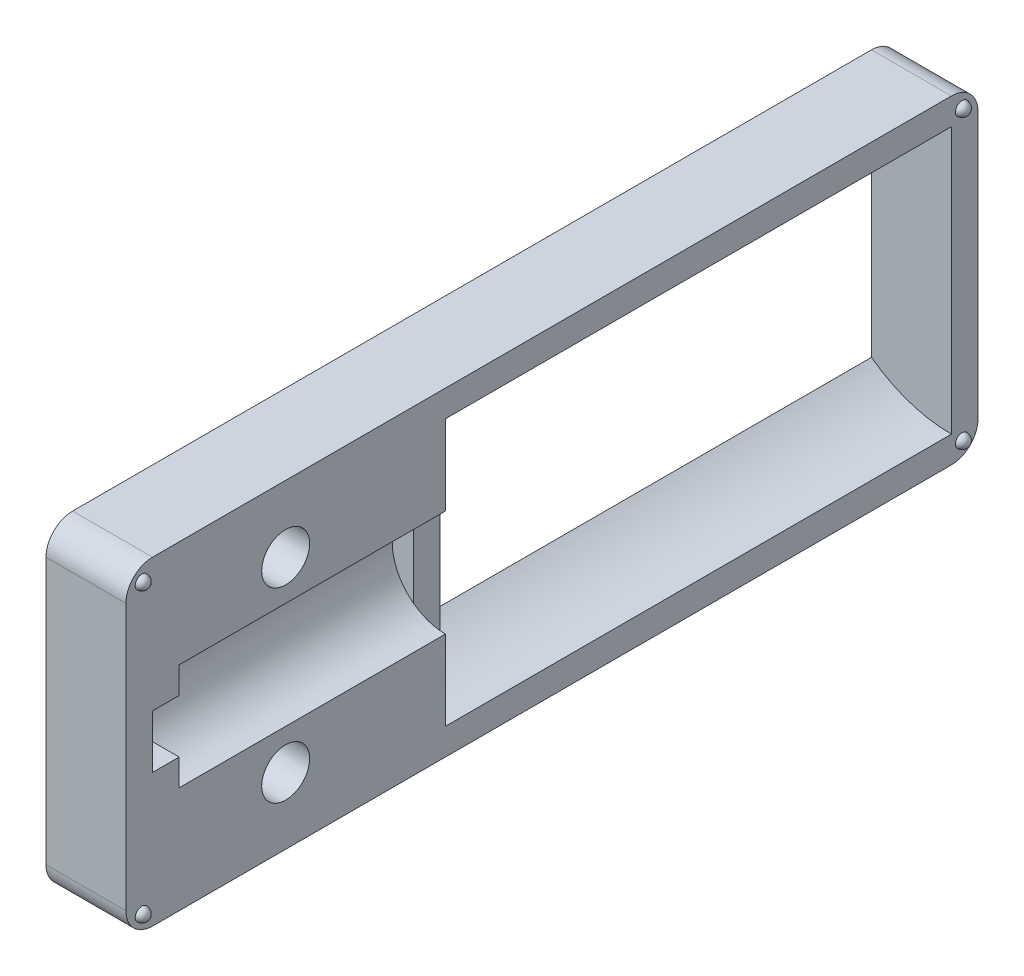
ISO-10303-21;
HEADER;
FILE_DESCRIPTION(('STEP AP214'),'2;1');
FILE_NAME('part.step','',(''),(''),'','','');
FILE_SCHEMA(('AUTOMOTIVE_DESIGN { 1 0 10303 214 1 1 1 1 }'));
ENDSEC;
DATA;
#1=APPLICATION_CONTEXT('core data for automotive mechanical design processes');
#2=APPLICATION_PROTOCOL_DEFINITION('international standard','automotive_design',2000,#1);
#3=PRODUCT_CONTEXT('',#1,'mechanical');
#4=PRODUCT('Part','Part','',(#3));
#5=PRODUCT_RELATED_PRODUCT_CATEGORY('part','',(#4));
#6=PRODUCT_DEFINITION_FORMATION('','',#4);
#7=PRODUCT_DEFINITION_CONTEXT('part definition',#1,'design');
#8=PRODUCT_DEFINITION('design','',#6,#7);
#9=PRODUCT_DEFINITION_SHAPE('','',#8);
#10=(LENGTH_UNIT() NAMED_UNIT(*) SI_UNIT(.MILLI.,.METRE.));
#11=(NAMED_UNIT(*) PLANE_ANGLE_UNIT() SI_UNIT($,.RADIAN.));
#12=(NAMED_UNIT(*) SI_UNIT($,.STERADIAN.) SOLID_ANGLE_UNIT());
#13=UNCERTAINTY_MEASURE_WITH_UNIT(LENGTH_MEASURE(1.E-05),#10,'distance_accuracy_value','');
#14=(GEOMETRIC_REPRESENTATION_CONTEXT(3) GLOBAL_UNCERTAINTY_ASSIGNED_CONTEXT((#13)) GLOBAL_UNIT_ASSIGNED_CONTEXT((#10,
#11,#12)) REPRESENTATION_CONTEXT('',''));
#15=CARTESIAN_POINT('',(0.,0.,0.));
#16=DIRECTION('',(0.,0.,1.));
#17=DIRECTION('',(1.,0.,0.));
#18=AXIS2_PLACEMENT_3D('',#15,#16,#17);
#19=CARTESIAN_POINT('',(3.,6.,10.));
#20=DIRECTION('',(0.,0.,-1.));
#21=DIRECTION('',(-1.,0.,0.));
#22=AXIS2_PLACEMENT_3D('',#19,#20,#21);
#23=PLANE('',#22);
#24=DIRECTION('',(1.,0.,0.));
#25=VECTOR('',#24,1.);
#26=CARTESIAN_POINT('',(3.,7.,10.));
#27=LINE('',#26,#25);
#28=CARTESIAN_POINT('',(1.26794919243112,7.,10.));
#29=VERTEX_POINT('',#28);
#30=CARTESIAN_POINT('',(3.,7.,10.));
#31=VERTEX_POINT('',#30);
#32=EDGE_CURVE('E199',#29,#31,#27,.T.);
#33=ORIENTED_EDGE('',*,*,#32,.F.);
#34=CARTESIAN_POINT('',(3.,6.,10.));
#35=DIRECTION('',(0.,0.,-1.));
#36=DIRECTION('',(-1.,0.,0.));
#37=AXIS2_PLACEMENT_3D('',#34,#35,#36);
#38=CIRCLE('',#37,2.);
#39=CARTESIAN_POINT('',(3.,8.,10.));
#40=VERTEX_POINT('',#39);
#41=EDGE_CURVE('E216',#29,#40,#38,.T.);
#42=ORIENTED_EDGE('',*,*,#41,.T.);
#43=DIRECTION('',(0.,1.,0.));
#44=VECTOR('',#43,1.);
#45=CARTESIAN_POINT('',(3.,0.,10.));
#46=LINE('',#45,#44);
#47=EDGE_CURVE('E300',#31,#40,#46,.T.);
#48=ORIENTED_EDGE('',*,*,#47,.F.);
#49=EDGE_LOOP('',(#33,#42,#48));
#50=FACE_BOUND('',#49,.T.);
#51=ADVANCED_FACE('F34',(#50),#23,.T.);
#52=CARTESIAN_POINT('',(0.,0.,0.));
#53=DIRECTION('',(0.,0.,-1.));
#54=DIRECTION('',(-1.,0.,0.));
#55=AXIS2_PLACEMENT_3D('',#52,#53,#54);
#56=PLANE('',#55);
#57=CARTESIAN_POINT('',(3.,6.,0.));
#58=DIRECTION('',(0.,0.,-1.));
#59=DIRECTION('',(-1.,0.,0.));
#60=AXIS2_PLACEMENT_3D('',#57,#58,#59);
#61=CIRCLE('',#60,2.);
#62=CARTESIAN_POINT('',(1.8,7.6,0.));
#63=VERTEX_POINT('',#62);
#64=CARTESIAN_POINT('',(3.,8.,0.));
#65=VERTEX_POINT('',#64);
#66=EDGE_CURVE('E217',#63,#65,#61,.T.);
#67=ORIENTED_EDGE('',*,*,#66,.F.);
#68=DIRECTION('',(0.,-1.,0.));
#69=VECTOR('',#68,1.);
#70=CARTESIAN_POINT('',(1.8,0.,0.));
#71=LINE('',#70,#69);
#72=CARTESIAN_POINT('',(1.8,10.8538644398046,0.));
#73=VERTEX_POINT('',#72);
#74=EDGE_CURVE('E293',#73,#63,#71,.T.);
#75=ORIENTED_EDGE('',*,*,#74,.F.);
#76=CARTESIAN_POINT('',(3.,6.,0.));
#77=DIRECTION('',(0.,0.,1.));
#78=DIRECTION('',(1.,0.,0.));
#79=AXIS2_PLACEMENT_3D('',#76,#77,#78);
#80=CIRCLE('',#79,5.);
#81=CARTESIAN_POINT('',(3.,11.,0.));
#82=VERTEX_POINT('',#81);
#83=EDGE_CURVE('E247',#82,#73,#80,.T.);
#84=ORIENTED_EDGE('',*,*,#83,.F.);
#85=DIRECTION('',(0.,1.,0.));
#86=VECTOR('',#85,1.);
#87=CARTESIAN_POINT('',(3.,12.,0.));
#88=LINE('',#87,#86);
#89=EDGE_CURVE('E239',#65,#82,#88,.T.);
#90=ORIENTED_EDGE('',*,*,#89,.F.);
#91=EDGE_LOOP('',(#67,#75,#84,#90));
#92=FACE_BOUND('',#91,.T.);
#93=ADVANCED_FACE('F400',(#92),#56,.T.);
#94=CARTESIAN_POINT('',(0.,0.,-20.));
#95=DIRECTION('',(1.,0.,0.));
#96=DIRECTION('',(0.,0.,-1.));
#97=AXIS2_PLACEMENT_3D('',#94,#95,#96);
#98=PLANE('',#97);
#99=CARTESIAN_POINT('',(0.,2.5,6.));
#100=DIRECTION('',(1.,0.,0.));
#101=DIRECTION('',(0.,0.,1.));
#102=AXIS2_PLACEMENT_3D('',#99,#100,#101);
#103=CIRCLE('',#102,1.6);
#104=CARTESIAN_POINT('',(0.,2.5,7.6));
#105=VERTEX_POINT('',#104);
#106=EDGE_CURVE('E374',#105,#105,#103,.T.);
#107=ORIENTED_EDGE('',*,*,#106,.T.);
#108=EDGE_LOOP('',(#107));
#109=FACE_BOUND('',#108,.T.);
#110=CARTESIAN_POINT('',(0.,9.5,6.));
#111=DIRECTION('',(-1.,0.,0.));
#112=DIRECTION('',(0.,0.,1.));
#113=AXIS2_PLACEMENT_3D('',#110,#111,#112);
#114=CIRCLE('',#113,1.6);
#115=CARTESIAN_POINT('',(0.,9.5,7.6));
#116=VERTEX_POINT('',#115);
#117=EDGE_CURVE('E364',#116,#116,#114,.T.);
#118=ORIENTED_EDGE('',*,*,#117,.F.);
#119=EDGE_LOOP('',(#118));
#120=FACE_BOUND('',#119,.T.);
#121=DIRECTION('',(0.,0.,1.));
#122=VECTOR('',#121,1.);
#123=CARTESIAN_POINT('',(0.,10.,-19.));
#124=LINE('',#123,#122);
#125=CARTESIAN_POINT('',(0.,10.,-19.));
#126=VERTEX_POINT('',#125);
#127=CARTESIAN_POINT('',(0.,10.,-1.));
#128=VERTEX_POINT('',#127);
#129=EDGE_CURVE('E263',#126,#128,#124,.T.);
#130=ORIENTED_EDGE('',*,*,#129,.T.);
#131=DIRECTION('',(0.,-1.,0.));
#132=VECTOR('',#131,1.);
#133=CARTESIAN_POINT('',(0.,12.,-1.));
#134=LINE('',#133,#132);
#135=CARTESIAN_POINT('',(0.,2.,-1.));
#136=VERTEX_POINT('',#135);
#137=EDGE_CURVE('E225',#128,#136,#134,.T.);
#138=ORIENTED_EDGE('',*,*,#137,.T.);
#139=DIRECTION('',(0.,0.,1.));
#140=VECTOR('',#139,1.);
#141=CARTESIAN_POINT('',(0.,2.,-19.));
#142=LINE('',#141,#140);
#143=CARTESIAN_POINT('',(0.,2.,-19.));
#144=VERTEX_POINT('',#143);
#145=EDGE_CURVE('E261',#136,#144,#142,.F.);
#146=ORIENTED_EDGE('',*,*,#145,.T.);
#147=DIRECTION('',(0.,-1.,0.));
#148=VECTOR('',#147,1.);
#149=CARTESIAN_POINT('',(0.,0.,-19.));
#150=LINE('',#149,#148);
#151=EDGE_CURVE('E266',#126,#144,#150,.T.);
#152=ORIENTED_EDGE('',*,*,#151,.F.);
#153=EDGE_LOOP('',(#130,#138,#146,#152));
#154=FACE_BOUND('',#153,.T.);
#155=DIRECTION('',(0.,0.,1.));
#156=VECTOR('',#155,1.);
#157=CARTESIAN_POINT('',(0.,0.,-20.));
#158=LINE('',#157,#156);
#159=CARTESIAN_POINT('',(0.,0.,-19.));
#160=VERTEX_POINT('',#159);
#161=CARTESIAN_POINT('',(0.,0.,11.));
#162=VERTEX_POINT('',#161);
#163=EDGE_CURVE('E274',#160,#162,#158,.T.);
#164=ORIENTED_EDGE('',*,*,#163,.T.);
#165=CARTESIAN_POINT('',(0.,1.,11.));
#166=DIRECTION('',(1.,0.,0.));
#167=DIRECTION('',(0.,0.,-1.));
#168=AXIS2_PLACEMENT_3D('',#165,#166,#167);
#169=CIRCLE('',#168,1.);
#170=CARTESIAN_POINT('',(0.,1.,12.));
#171=VERTEX_POINT('',#170);
#172=EDGE_CURVE('E326',#162,#171,#169,.F.);
#173=ORIENTED_EDGE('',*,*,#172,.T.);
#174=DIRECTION('',(0.,-1.,0.));
#175=VECTOR('',#174,1.);
#176=CARTESIAN_POINT('',(0.,12.,12.));
#177=LINE('',#176,#175);
#178=CARTESIAN_POINT('',(0.,11.,12.));
#179=VERTEX_POINT('',#178);
#180=EDGE_CURVE('E243',#179,#171,#177,.T.);
#181=ORIENTED_EDGE('',*,*,#180,.F.);
#182=CARTESIAN_POINT('',(0.,11.,11.));
#183=DIRECTION('',(1.,0.,0.));
#184=DIRECTION('',(0.,0.,-1.));
#185=AXIS2_PLACEMENT_3D('',#182,#183,#184);
#186=CIRCLE('',#185,1.);
#187=CARTESIAN_POINT('',(0.,12.,11.));
#188=VERTEX_POINT('',#187);
#189=EDGE_CURVE('E324',#179,#188,#186,.F.);
#190=ORIENTED_EDGE('',*,*,#189,.T.);
#191=DIRECTION('',(0.,0.,1.));
#192=VECTOR('',#191,1.);
#193=CARTESIAN_POINT('',(0.,12.,-20.));
#194=LINE('',#193,#192);
#195=CARTESIAN_POINT('',(0.,12.,-19.));
#196=VERTEX_POINT('',#195);
#197=EDGE_CURVE('E283',#196,#188,#194,.T.);
#198=ORIENTED_EDGE('',*,*,#197,.F.);
#199=CARTESIAN_POINT('',(0.,11.,-19.));
#200=DIRECTION('',(1.,0.,0.));
#201=DIRECTION('',(0.,0.,-1.));
#202=AXIS2_PLACEMENT_3D('',#199,#200,#201);
#203=CIRCLE('',#202,1.);
#204=CARTESIAN_POINT('',(0.,11.,-20.));
#205=VERTEX_POINT('',#204);
#206=EDGE_CURVE('E49',#196,#205,#203,.F.);
#207=ORIENTED_EDGE('',*,*,#206,.T.);
#208=DIRECTION('',(0.,1.,0.));
#209=VECTOR('',#208,1.);
#210=CARTESIAN_POINT('',(0.,0.,-20.));
#211=LINE('',#210,#209);
#212=CARTESIAN_POINT('',(0.,1.,-20.));
#213=VERTEX_POINT('',#212);
#214=EDGE_CURVE('E269',#213,#205,#211,.T.);
#215=ORIENTED_EDGE('',*,*,#214,.F.);
#216=CARTESIAN_POINT('',(0.,1.,-19.));
#217=DIRECTION('',(1.,0.,0.));
#218=DIRECTION('',(0.,0.,-1.));
#219=AXIS2_PLACEMENT_3D('',#216,#217,#218);
#220=CIRCLE('',#219,1.);
#221=EDGE_CURVE('E322',#213,#160,#220,.F.);
#222=ORIENTED_EDGE('',*,*,#221,.T.);
#223=EDGE_LOOP('',(#164,#173,#181,#190,#198,#207,#215,#222));
#224=FACE_BOUND('',#223,.T.);
#225=ADVANCED_FACE('F440',(#109,#120,#154,#224),#98,.F.);
#226=CARTESIAN_POINT('',(0.,12.,-20.));
#227=DIRECTION('',(0.,-1.,0.));
#228=DIRECTION('',(0.,0.,-1.));
#229=AXIS2_PLACEMENT_3D('',#226,#227,#228);
#230=PLANE('',#229);
#231=ORIENTED_EDGE('',*,*,#197,.T.);
#232=DIRECTION('',(-1.,0.,0.));
#233=VECTOR('',#232,1.);
#234=CARTESIAN_POINT('',(0.,12.,11.));
#235=LINE('',#234,#233);
#236=CARTESIAN_POINT('',(3.,12.,11.));
#237=VERTEX_POINT('',#236);
#238=EDGE_CURVE('E330',#188,#237,#235,.F.);
#239=ORIENTED_EDGE('',*,*,#238,.T.);
#240=DIRECTION('',(0.,0.,1.));
#241=VECTOR('',#240,1.);
#242=CARTESIAN_POINT('',(3.,12.,-20.));
#243=LINE('',#242,#241);
#244=CARTESIAN_POINT('',(3.,12.,-19.));
#245=VERTEX_POINT('',#244);
#246=EDGE_CURVE('E280',#245,#237,#243,.T.);
#247=ORIENTED_EDGE('',*,*,#246,.F.);
#248=DIRECTION('',(1.,0.,0.));
#249=VECTOR('',#248,1.);
#250=CARTESIAN_POINT('',(0.,12.,-19.));
#251=LINE('',#250,#249);
#252=EDGE_CURVE('E328',#245,#196,#251,.F.);
#253=ORIENTED_EDGE('',*,*,#252,.T.);
#254=EDGE_LOOP('',(#231,#239,#247,#253));
#255=FACE_BOUND('',#254,.T.);
#256=ADVANCED_FACE('F349',(#255),#230,.F.);
#257=CARTESIAN_POINT('',(3.,0.,-20.));
#258=DIRECTION('',(1.,0.,0.));
#259=DIRECTION('',(0.,0.,-1.));
#260=AXIS2_PLACEMENT_3D('',#257,#258,#259);
#261=PLANE('',#260);
#262=CARTESIAN_POINT('',(3.,0.6,11.4));
#263=DIRECTION('',(1.,0.,0.));
#264=DIRECTION('',(0.,0.,-1.));
#265=AXIS2_PLACEMENT_3D('',#262,#263,#264);
#266=CIRCLE('',#265,0.25);
#267=CARTESIAN_POINT('',(3.,0.6,11.15));
#268=VERTEX_POINT('',#267);
#269=EDGE_CURVE('E12',#268,#268,#266,.T.);
#270=ORIENTED_EDGE('',*,*,#269,.F.);
#271=EDGE_LOOP('',(#270));
#272=FACE_BOUND('',#271,.T.);
#273=CARTESIAN_POINT('',(3.,0.6,-19.4));
#274=DIRECTION('',(1.,0.,0.));
#275=DIRECTION('',(0.,0.,-1.));
#276=AXIS2_PLACEMENT_3D('',#273,#274,#275);
#277=CIRCLE('',#276,0.25);
#278=CARTESIAN_POINT('',(3.,0.6,-19.65));
#279=VERTEX_POINT('',#278);
#280=EDGE_CURVE('E42',#279,#279,#277,.T.);
#281=ORIENTED_EDGE('',*,*,#280,.F.);
#282=EDGE_LOOP('',(#281));
#283=FACE_BOUND('',#282,.T.);
#284=CARTESIAN_POINT('',(3.,11.4,11.4));
#285=DIRECTION('',(1.,0.,0.));
#286=DIRECTION('',(0.,0.,-1.));
#287=AXIS2_PLACEMENT_3D('',#284,#285,#286);
#288=CIRCLE('',#287,0.25);
#289=CARTESIAN_POINT('',(3.,11.4,11.15));
#290=VERTEX_POINT('',#289);
#291=EDGE_CURVE('E339',#290,#290,#288,.T.);
#292=ORIENTED_EDGE('',*,*,#291,.F.);
#293=EDGE_LOOP('',(#292));
#294=FACE_BOUND('',#293,.T.);
#295=CARTESIAN_POINT('',(3.,11.4,-19.4));
#296=DIRECTION('',(1.,0.,0.));
#297=DIRECTION('',(0.,0.,-1.));
#298=AXIS2_PLACEMENT_3D('',#295,#296,#297);
#299=CIRCLE('',#298,0.25);
#300=CARTESIAN_POINT('',(3.,11.4,-19.65));
#301=VERTEX_POINT('',#300);
#302=EDGE_CURVE('E336',#301,#301,#299,.T.);
#303=ORIENTED_EDGE('',*,*,#302,.F.);
#304=EDGE_LOOP('',(#303));
#305=FACE_BOUND('',#304,.T.);
#306=CARTESIAN_POINT('',(3.,2.5,6.));
#307=DIRECTION('',(1.,0.,0.));
#308=DIRECTION('',(0.,0.,1.));
#309=AXIS2_PLACEMENT_3D('',#306,#307,#308);
#310=CIRCLE('',#309,0.899999999999999);
#311=CARTESIAN_POINT('',(3.,2.5,6.9));
#312=VERTEX_POINT('',#311);
#313=EDGE_CURVE('E359',#312,#312,#310,.T.);
#314=ORIENTED_EDGE('',*,*,#313,.F.);
#315=EDGE_LOOP('',(#314));
#316=FACE_BOUND('',#315,.T.);
#317=CARTESIAN_POINT('',(3.,9.5,6.));
#318=DIRECTION('',(-1.,0.,0.));
#319=DIRECTION('',(0.,0.,1.));
#320=AXIS2_PLACEMENT_3D('',#317,#318,#319);
#321=CIRCLE('',#320,0.899999999999999);
#322=CARTESIAN_POINT('',(3.,9.5,6.9));
#323=VERTEX_POINT('',#322);
#324=EDGE_CURVE('E362',#323,#323,#321,.T.);
#325=ORIENTED_EDGE('',*,*,#324,.T.);
#326=EDGE_LOOP('',(#325));
#327=FACE_BOUND('',#326,.T.);
#328=DIRECTION('',(0.,0.,-1.));
#329=VECTOR('',#328,1.);
#330=CARTESIAN_POINT('',(3.,7.,11.));
#331=LINE('',#330,#329);
#332=CARTESIAN_POINT('',(3.,7.,11.));
#333=VERTEX_POINT('',#332);
#334=EDGE_CURVE('E383',#333,#31,#331,.T.);
#335=ORIENTED_EDGE('',*,*,#334,.T.);
#336=ORIENTED_EDGE('',*,*,#47,.T.);
#337=DIRECTION('',(0.,0.,-1.));
#338=VECTOR('',#337,1.);
#339=CARTESIAN_POINT('',(3.,8.,10.));
#340=LINE('',#339,#338);
#341=EDGE_CURVE('E215',#65,#40,#340,.F.);
#342=ORIENTED_EDGE('',*,*,#341,.F.);
#343=ORIENTED_EDGE('',*,*,#89,.T.);
#344=DIRECTION('',(0.,0.,1.));
#345=VECTOR('',#344,1.);
#346=CARTESIAN_POINT('',(3.,11.,-19.));
#347=LINE('',#346,#345);
#348=CARTESIAN_POINT('',(3.,11.,-19.));
#349=VERTEX_POINT('',#348);
#350=EDGE_CURVE('E258',#349,#82,#347,.T.);
#351=ORIENTED_EDGE('',*,*,#350,.F.);
#352=DIRECTION('',(0.,-1.,0.));
#353=VECTOR('',#352,1.);
#354=CARTESIAN_POINT('',(3.,0.,-19.));
#355=LINE('',#354,#353);
#356=CARTESIAN_POINT('',(3.,0.999999999999997,-19.));
#357=VERTEX_POINT('',#356);
#358=EDGE_CURVE('E289',#349,#357,#355,.T.);
#359=ORIENTED_EDGE('',*,*,#358,.T.);
#360=DIRECTION('',(0.,0.,1.));
#361=VECTOR('',#360,1.);
#362=CARTESIAN_POINT('',(3.,0.999999999999997,-19.));
#363=LINE('',#362,#361);
#364=CARTESIAN_POINT('',(3.,0.999999999999997,0.));
#365=VERTEX_POINT('',#364);
#366=EDGE_CURVE('E253',#365,#357,#363,.F.);
#367=ORIENTED_EDGE('',*,*,#366,.F.);
#368=CARTESIAN_POINT('',(3.,4.,0.));
#369=VERTEX_POINT('',#368);
#370=EDGE_CURVE('E244',#365,#369,#88,.T.);
#371=ORIENTED_EDGE('',*,*,#370,.T.);
#372=DIRECTION('',(0.,0.,-1.));
#373=VECTOR('',#372,1.);
#374=CARTESIAN_POINT('',(3.,4.,10.));
#375=LINE('',#374,#373);
#376=CARTESIAN_POINT('',(3.,4.,10.));
#377=VERTEX_POINT('',#376);
#378=EDGE_CURVE('E223',#377,#369,#375,.T.);
#379=ORIENTED_EDGE('',*,*,#378,.F.);
#380=CARTESIAN_POINT('',(3.,5.,10.));
#381=VERTEX_POINT('',#380);
#382=EDGE_CURVE('E205',#377,#381,#46,.T.);
#383=ORIENTED_EDGE('',*,*,#382,.T.);
#384=DIRECTION('',(0.,0.,-1.));
#385=VECTOR('',#384,1.);
#386=CARTESIAN_POINT('',(3.,5.,11.));
#387=LINE('',#386,#385);
#388=CARTESIAN_POINT('',(3.,5.,11.));
#389=VERTEX_POINT('',#388);
#390=EDGE_CURVE('E183',#389,#381,#387,.T.);
#391=ORIENTED_EDGE('',*,*,#390,.F.);
#392=DIRECTION('',(0.,-1.,0.));
#393=VECTOR('',#392,1.);
#394=CARTESIAN_POINT('',(3.,7.,11.));
#395=LINE('',#394,#393);
#396=EDGE_CURVE('E190',#333,#389,#395,.T.);
#397=ORIENTED_EDGE('',*,*,#396,.F.);
#398=EDGE_LOOP('',(#335,#336,#342,#343,#351,#359,#367,#371,#379,#383,#391,#397));
#399=FACE_BOUND('',#398,.T.);
#400=DIRECTION('',(0.,1.,0.));
#401=VECTOR('',#400,1.);
#402=CARTESIAN_POINT('',(3.,12.,12.));
#403=LINE('',#402,#401);
#404=CARTESIAN_POINT('',(3.,1.,12.));
#405=VERTEX_POINT('',#404);
#406=CARTESIAN_POINT('',(3.,11.,12.));
#407=VERTEX_POINT('',#406);
#408=EDGE_CURVE('E240',#405,#407,#403,.T.);
#409=ORIENTED_EDGE('',*,*,#408,.F.);
#410=CARTESIAN_POINT('',(3.,1.,11.));
#411=DIRECTION('',(1.,0.,0.));
#412=DIRECTION('',(0.,0.,-1.));
#413=AXIS2_PLACEMENT_3D('',#410,#411,#412);
#414=CIRCLE('',#413,1.);
#415=CARTESIAN_POINT('',(3.,0.,11.));
#416=VERTEX_POINT('',#415);
#417=EDGE_CURVE('E314',#405,#416,#414,.T.);
#418=ORIENTED_EDGE('',*,*,#417,.T.);
#419=DIRECTION('',(0.,0.,1.));
#420=VECTOR('',#419,1.);
#421=CARTESIAN_POINT('',(3.,0.,-20.));
#422=LINE('',#421,#420);
#423=CARTESIAN_POINT('',(3.,0.,-19.));
#424=VERTEX_POINT('',#423);
#425=EDGE_CURVE('E277',#424,#416,#422,.T.);
#426=ORIENTED_EDGE('',*,*,#425,.F.);
#427=CARTESIAN_POINT('',(3.,1.,-19.));
#428=DIRECTION('',(1.,0.,0.));
#429=DIRECTION('',(0.,0.,-1.));
#430=AXIS2_PLACEMENT_3D('',#427,#428,#429);
#431=CIRCLE('',#430,1.);
#432=CARTESIAN_POINT('',(3.,1.,-20.));
#433=VERTEX_POINT('',#432);
#434=EDGE_CURVE('E310',#424,#433,#431,.T.);
#435=ORIENTED_EDGE('',*,*,#434,.T.);
#436=DIRECTION('',(0.,1.,0.));
#437=VECTOR('',#436,1.);
#438=CARTESIAN_POINT('',(3.,0.,-20.));
#439=LINE('',#438,#437);
#440=CARTESIAN_POINT('',(3.,11.,-20.));
#441=VERTEX_POINT('',#440);
#442=EDGE_CURVE('E271',#433,#441,#439,.T.);
#443=ORIENTED_EDGE('',*,*,#442,.T.);
#444=CARTESIAN_POINT('',(3.,11.,-19.));
#445=DIRECTION('',(1.,0.,0.));
#446=DIRECTION('',(0.,0.,-1.));
#447=AXIS2_PLACEMENT_3D('',#444,#445,#446);
#448=CIRCLE('',#447,1.);
#449=EDGE_CURVE('E308',#441,#245,#448,.T.);
#450=ORIENTED_EDGE('',*,*,#449,.T.);
#451=ORIENTED_EDGE('',*,*,#246,.T.);
#452=CARTESIAN_POINT('',(3.,11.,11.));
#453=DIRECTION('',(1.,0.,0.));
#454=DIRECTION('',(0.,0.,-1.));
#455=AXIS2_PLACEMENT_3D('',#452,#453,#454);
#456=CIRCLE('',#455,1.);
#457=EDGE_CURVE('E312',#237,#407,#456,.T.);
#458=ORIENTED_EDGE('',*,*,#457,.T.);
#459=EDGE_LOOP('',(#409,#418,#426,#435,#443,#450,#451,#458));
#460=FACE_BOUND('',#459,.T.);
#461=ADVANCED_FACE('F202',(#272,#283,#294,#305,#316,#327,#399,#460),#261,.T.);
#462=CARTESIAN_POINT('',(0.,0.,-20.));
#463=DIRECTION('',(0.,-1.,0.));
#464=DIRECTION('',(0.,0.,-1.));
#465=AXIS2_PLACEMENT_3D('',#462,#463,#464);
#466=PLANE('',#465);
#467=ORIENTED_EDGE('',*,*,#425,.T.);
#468=DIRECTION('',(1.,0.,0.));
#469=VECTOR('',#468,1.);
#470=CARTESIAN_POINT('',(0.,0.,11.));
#471=LINE('',#470,#469);
#472=EDGE_CURVE('E319',#416,#162,#471,.F.);
#473=ORIENTED_EDGE('',*,*,#472,.T.);
#474=ORIENTED_EDGE('',*,*,#163,.F.);
#475=DIRECTION('',(1.,0.,0.));
#476=VECTOR('',#475,1.);
#477=CARTESIAN_POINT('',(0.,0.,-19.));
#478=LINE('',#477,#476);
#479=EDGE_CURVE('E316',#160,#424,#478,.T.);
#480=ORIENTED_EDGE('',*,*,#479,.T.);
#481=EDGE_LOOP('',(#467,#473,#474,#480));
#482=FACE_BOUND('',#481,.T.);
#483=ADVANCED_FACE('F348',(#482),#466,.T.);
#484=CARTESIAN_POINT('',(0.,0.,-20.));
#485=DIRECTION('',(0.,0.,-1.));
#486=DIRECTION('',(-1.,0.,0.));
#487=AXIS2_PLACEMENT_3D('',#484,#485,#486);
#488=PLANE('',#487);
#489=ORIENTED_EDGE('',*,*,#442,.F.);
#490=DIRECTION('',(1.,0.,0.));
#491=VECTOR('',#490,1.);
#492=CARTESIAN_POINT('',(0.,1.,-20.));
#493=LINE('',#492,#491);
#494=EDGE_CURVE('E56',#433,#213,#493,.F.);
#495=ORIENTED_EDGE('',*,*,#494,.T.);
#496=ORIENTED_EDGE('',*,*,#214,.T.);
#497=DIRECTION('',(1.,0.,0.));
#498=VECTOR('',#497,1.);
#499=CARTESIAN_POINT('',(3.,11.,-20.));
#500=LINE('',#499,#498);
#501=EDGE_CURVE('E332',#205,#441,#500,.T.);
#502=ORIENTED_EDGE('',*,*,#501,.T.);
#503=EDGE_LOOP('',(#489,#495,#496,#502));
#504=FACE_BOUND('',#503,.T.);
#505=ADVANCED_FACE('F462',(#504),#488,.T.);
#506=CARTESIAN_POINT('',(3.,6.,-19.));
#507=DIRECTION('',(0.,0.,1.));
#508=DIRECTION('',(1.,0.,0.));
#509=AXIS2_PLACEMENT_3D('',#506,#507,#508);
#510=PLANE('',#509);
#511=ORIENTED_EDGE('',*,*,#151,.T.);
#512=CARTESIAN_POINT('',(3.,6.,-19.));
#513=DIRECTION('',(0.,0.,1.));
#514=DIRECTION('',(1.,0.,0.));
#515=AXIS2_PLACEMENT_3D('',#512,#513,#514);
#516=CIRCLE('',#515,5.);
#517=EDGE_CURVE('E254',#144,#357,#516,.T.);
#518=ORIENTED_EDGE('',*,*,#517,.T.);
#519=ORIENTED_EDGE('',*,*,#358,.F.);
#520=EDGE_CURVE('E250',#349,#126,#516,.T.);
#521=ORIENTED_EDGE('',*,*,#520,.T.);
#522=EDGE_LOOP('',(#511,#518,#519,#521));
#523=FACE_BOUND('',#522,.T.);
#524=ADVANCED_FACE('F409',(#523),#510,.T.);
#525=CARTESIAN_POINT('',(3.,6.,-19.));
#526=DIRECTION('',(0.,0.,1.));
#527=DIRECTION('',(1.,0.,0.));
#528=AXIS2_PLACEMENT_3D('',#525,#526,#527);
#529=CYLINDRICAL_SURFACE('',#528,5.);
#530=ORIENTED_EDGE('',*,*,#83,.T.);
#531=DIRECTION('',(0.,0.,1.));
#532=VECTOR('',#531,1.);
#533=CARTESIAN_POINT('',(1.8,10.8538644398046,-19.));
#534=LINE('',#533,#532);
#535=CARTESIAN_POINT('',(1.8,10.8538644398046,-1.));
#536=VERTEX_POINT('',#535);
#537=EDGE_CURVE('E234',#73,#536,#534,.F.);
#538=ORIENTED_EDGE('',*,*,#537,.T.);
#539=CARTESIAN_POINT('',(3.,6.,-1.));
#540=DIRECTION('',(0.,0.,1.));
#541=DIRECTION('',(1.,0.,0.));
#542=AXIS2_PLACEMENT_3D('',#539,#540,#541);
#543=CIRCLE('',#542,5.);
#544=EDGE_CURVE('E236',#128,#536,#543,.F.);
#545=ORIENTED_EDGE('',*,*,#544,.F.);
#546=ORIENTED_EDGE('',*,*,#129,.F.);
#547=ORIENTED_EDGE('',*,*,#520,.F.);
#548=ORIENTED_EDGE('',*,*,#350,.T.);
#549=EDGE_LOOP('',(#530,#538,#545,#546,#547,#548));
#550=FACE_BOUND('',#549,.T.);
#551=ADVANCED_FACE('F404',(#550),#529,.F.);
#552=CARTESIAN_POINT('',(3.,6.,-1.));
#553=DIRECTION('',(0.,0.,1.));
#554=DIRECTION('',(1.,0.,0.));
#555=AXIS2_PLACEMENT_3D('',#552,#553,#554);
#556=CIRCLE('',#555,5.);
#557=CARTESIAN_POINT('',(1.8,1.14613556019536,-1.));
#558=VERTEX_POINT('',#557);
#559=EDGE_CURVE('E296',#558,#136,#556,.F.);
#560=ORIENTED_EDGE('',*,*,#559,.F.);
#561=DIRECTION('',(0.,0.,1.));
#562=VECTOR('',#561,1.);
#563=CARTESIAN_POINT('',(1.8,1.14613556019536,-19.));
#564=LINE('',#563,#562);
#565=CARTESIAN_POINT('',(1.8,1.14613556019536,0.));
#566=VERTEX_POINT('',#565);
#567=EDGE_CURVE('E231',#558,#566,#564,.T.);
#568=ORIENTED_EDGE('',*,*,#567,.T.);
#569=CARTESIAN_POINT('',(3.,6.,0.));
#570=DIRECTION('',(0.,0.,-1.));
#571=DIRECTION('',(-1.,0.,0.));
#572=AXIS2_PLACEMENT_3D('',#569,#570,#571);
#573=CIRCLE('',#572,5.);
#574=EDGE_CURVE('E286',#365,#566,#573,.T.);
#575=ORIENTED_EDGE('',*,*,#574,.F.);
#576=ORIENTED_EDGE('',*,*,#366,.T.);
#577=ORIENTED_EDGE('',*,*,#517,.F.);
#578=ORIENTED_EDGE('',*,*,#145,.F.);
#579=EDGE_LOOP('',(#560,#568,#575,#576,#577,#578));
#580=FACE_BOUND('',#579,.T.);
#581=ADVANCED_FACE('F413',(#580),#529,.F.);
#582=CARTESIAN_POINT('',(1.8,4.4,0.));
#583=VERTEX_POINT('',#582);
#584=EDGE_CURVE('E219',#369,#583,#61,.T.);
#585=ORIENTED_EDGE('',*,*,#584,.F.);
#586=ORIENTED_EDGE('',*,*,#370,.F.);
#587=ORIENTED_EDGE('',*,*,#574,.T.);
#588=EDGE_CURVE('E292',#583,#566,#71,.T.);
#589=ORIENTED_EDGE('',*,*,#588,.F.);
#590=EDGE_LOOP('',(#585,#586,#587,#589));
#591=FACE_BOUND('',#590,.T.);
#592=ADVANCED_FACE('F418',(#591),#56,.T.);
#593=CARTESIAN_POINT('',(0.,0.,12.));
#594=DIRECTION('',(0.,0.,-1.));
#595=DIRECTION('',(-1.,0.,0.));
#596=AXIS2_PLACEMENT_3D('',#593,#594,#595);
#597=PLANE('',#596);
#598=ORIENTED_EDGE('',*,*,#180,.T.);
#599=DIRECTION('',(1.,0.,0.));
#600=VECTOR('',#599,1.);
#601=CARTESIAN_POINT('',(3.,1.,12.));
#602=LINE('',#601,#600);
#603=EDGE_CURVE('E305',#171,#405,#602,.T.);
#604=ORIENTED_EDGE('',*,*,#603,.T.);
#605=ORIENTED_EDGE('',*,*,#408,.T.);
#606=DIRECTION('',(-1.,0.,0.));
#607=VECTOR('',#606,1.);
#608=CARTESIAN_POINT('',(0.,11.,12.));
#609=LINE('',#608,#607);
#610=EDGE_CURVE('E302',#407,#179,#609,.T.);
#611=ORIENTED_EDGE('',*,*,#610,.T.);
#612=EDGE_LOOP('',(#598,#604,#605,#611));
#613=FACE_BOUND('',#612,.T.);
#614=ADVANCED_FACE('F450',(#613),#597,.F.);
#615=CARTESIAN_POINT('',(0.,0.,-1.));
#616=DIRECTION('',(0.,0.,1.));
#617=DIRECTION('',(1.,0.,0.));
#618=AXIS2_PLACEMENT_3D('',#615,#616,#617);
#619=PLANE('',#618);
#620=ORIENTED_EDGE('',*,*,#137,.F.);
#621=ORIENTED_EDGE('',*,*,#544,.T.);
#622=DIRECTION('',(0.,1.,0.));
#623=VECTOR('',#622,1.);
#624=CARTESIAN_POINT('',(1.8,12.,-1.));
#625=LINE('',#624,#623);
#626=EDGE_CURVE('E228',#558,#536,#625,.T.);
#627=ORIENTED_EDGE('',*,*,#626,.F.);
#628=ORIENTED_EDGE('',*,*,#559,.T.);
#629=EDGE_LOOP('',(#620,#621,#627,#628));
#630=FACE_BOUND('',#629,.T.);
#631=ADVANCED_FACE('F455',(#630),#619,.F.);
#632=CARTESIAN_POINT('',(1.8,12.,-1.));
#633=DIRECTION('',(1.,0.,0.));
#634=DIRECTION('',(0.,1.,0.));
#635=AXIS2_PLACEMENT_3D('',#632,#633,#634);
#636=PLANE('',#635);
#637=ORIENTED_EDGE('',*,*,#537,.F.);
#638=ORIENTED_EDGE('',*,*,#74,.T.);
#639=EDGE_CURVE('E297',#63,#583,#71,.T.);
#640=ORIENTED_EDGE('',*,*,#639,.T.);
#641=ORIENTED_EDGE('',*,*,#588,.T.);
#642=ORIENTED_EDGE('',*,*,#567,.F.);
#643=ORIENTED_EDGE('',*,*,#626,.T.);
#644=EDGE_LOOP('',(#637,#638,#640,#641,#642,#643));
#645=FACE_BOUND('',#644,.T.);
#646=ADVANCED_FACE('F433',(#645),#636,.T.);
#647=CARTESIAN_POINT('',(3.,6.,10.));
#648=DIRECTION('',(0.,0.,-1.));
#649=DIRECTION('',(-1.,0.,0.));
#650=AXIS2_PLACEMENT_3D('',#647,#648,#649);
#651=CYLINDRICAL_SURFACE('',#650,2.);
#652=ORIENTED_EDGE('',*,*,#378,.T.);
#653=ORIENTED_EDGE('',*,*,#584,.T.);
#654=EDGE_CURVE('E220',#583,#63,#61,.T.);
#655=ORIENTED_EDGE('',*,*,#654,.T.);
#656=ORIENTED_EDGE('',*,*,#66,.T.);
#657=ORIENTED_EDGE('',*,*,#341,.T.);
#658=ORIENTED_EDGE('',*,*,#41,.F.);
#659=DIRECTION('',(0.,0.,-1.));
#660=VECTOR('',#659,1.);
#661=CARTESIAN_POINT('',(1.26794919243112,7.,11.));
#662=LINE('',#661,#660);
#663=CARTESIAN_POINT('',(1.26794919243112,7.,11.));
#664=VERTEX_POINT('',#663);
#665=EDGE_CURVE('E207',#664,#29,#662,.T.);
#666=ORIENTED_EDGE('',*,*,#665,.F.);
#667=CARTESIAN_POINT('',(3.,6.,11.));
#668=DIRECTION('',(0.,0.,-1.));
#669=DIRECTION('',(-1.,0.,0.));
#670=AXIS2_PLACEMENT_3D('',#667,#668,#669);
#671=CIRCLE('',#670,2.);
#672=CARTESIAN_POINT('',(1.26794919243112,5.,11.));
#673=VERTEX_POINT('',#672);
#674=EDGE_CURVE('E189',#673,#664,#671,.T.);
#675=ORIENTED_EDGE('',*,*,#674,.F.);
#676=DIRECTION('',(0.,0.,-1.));
#677=VECTOR('',#676,1.);
#678=CARTESIAN_POINT('',(1.26794919243112,5.,11.));
#679=LINE('',#678,#677);
#680=CARTESIAN_POINT('',(1.26794919243112,5.,10.));
#681=VERTEX_POINT('',#680);
#682=EDGE_CURVE('E185',#673,#681,#679,.T.);
#683=ORIENTED_EDGE('',*,*,#682,.T.);
#684=EDGE_CURVE('E212',#377,#681,#38,.T.);
#685=ORIENTED_EDGE('',*,*,#684,.F.);
#686=EDGE_LOOP('',(#652,#653,#655,#656,#657,#658,#666,#675,#683,#685));
#687=FACE_BOUND('',#686,.T.);
#688=ADVANCED_FACE('F392',(#687),#651,.F.);
#689=DIRECTION('',(-1.,0.,0.));
#690=VECTOR('',#689,1.);
#691=CARTESIAN_POINT('',(3.,5.,10.));
#692=LINE('',#691,#690);
#693=EDGE_CURVE('E378',#381,#681,#692,.T.);
#694=ORIENTED_EDGE('',*,*,#693,.F.);
#695=ORIENTED_EDGE('',*,*,#382,.F.);
#696=ORIENTED_EDGE('',*,*,#684,.T.);
#697=EDGE_LOOP('',(#694,#695,#696));
#698=FACE_BOUND('',#697,.T.);
#699=ADVANCED_FACE('F423',(#698),#23,.T.);
#700=CARTESIAN_POINT('',(3.,6.,0.));
#701=DIRECTION('',(0.,0.,-1.));
#702=DIRECTION('',(-1.,0.,0.));
#703=AXIS2_PLACEMENT_3D('',#700,#701,#702);
#704=PLANE('',#703);
#705=ORIENTED_EDGE('',*,*,#639,.F.);
#706=ORIENTED_EDGE('',*,*,#654,.F.);
#707=EDGE_LOOP('',(#705,#706));
#708=FACE_BOUND('',#707,.T.);
#709=ADVANCED_FACE('F425',(#708),#704,.F.);
#710=CARTESIAN_POINT('',(3.,7.,11.));
#711=DIRECTION('',(0.,1.,0.));
#712=DIRECTION('',(-1.,0.,0.));
#713=AXIS2_PLACEMENT_3D('',#710,#711,#712);
#714=PLANE('',#713);
#715=ORIENTED_EDGE('',*,*,#32,.T.);
#716=ORIENTED_EDGE('',*,*,#334,.F.);
#717=DIRECTION('',(1.,0.,0.));
#718=VECTOR('',#717,1.);
#719=CARTESIAN_POINT('',(3.,7.,11.));
#720=LINE('',#719,#718);
#721=EDGE_CURVE('E196',#664,#333,#720,.T.);
#722=ORIENTED_EDGE('',*,*,#721,.F.);
#723=ORIENTED_EDGE('',*,*,#665,.T.);
#724=EDGE_LOOP('',(#715,#716,#722,#723));
#725=FACE_BOUND('',#724,.T.);
#726=ADVANCED_FACE('F386',(#725),#714,.F.);
#727=CARTESIAN_POINT('',(3.,5.,11.));
#728=DIRECTION('',(0.,-1.,0.));
#729=DIRECTION('',(1.,0.,0.));
#730=AXIS2_PLACEMENT_3D('',#727,#728,#729);
#731=PLANE('',#730);
#732=ORIENTED_EDGE('',*,*,#693,.T.);
#733=ORIENTED_EDGE('',*,*,#682,.F.);
#734=DIRECTION('',(-1.,0.,0.));
#735=VECTOR('',#734,1.);
#736=CARTESIAN_POINT('',(3.,5.,11.));
#737=LINE('',#736,#735);
#738=EDGE_CURVE('E178',#389,#673,#737,.T.);
#739=ORIENTED_EDGE('',*,*,#738,.F.);
#740=ORIENTED_EDGE('',*,*,#390,.T.);
#741=EDGE_LOOP('',(#732,#733,#739,#740));
#742=FACE_BOUND('',#741,.T.);
#743=ADVANCED_FACE('F181',(#742),#731,.F.);
#744=CARTESIAN_POINT('',(3.,6.,11.));
#745=DIRECTION('',(0.,0.,-1.));
#746=DIRECTION('',(-1.,0.,0.));
#747=AXIS2_PLACEMENT_3D('',#744,#745,#746);
#748=PLANE('',#747);
#749=ORIENTED_EDGE('',*,*,#396,.T.);
#750=ORIENTED_EDGE('',*,*,#738,.T.);
#751=ORIENTED_EDGE('',*,*,#674,.T.);
#752=ORIENTED_EDGE('',*,*,#721,.T.);
#753=EDGE_LOOP('',(#749,#750,#751,#752));
#754=FACE_BOUND('',#753,.T.);
#755=ADVANCED_FACE('F194',(#754),#748,.T.);
#756=CARTESIAN_POINT('',(0.6,9.5,6.));
#757=DIRECTION('',(-1.,0.,0.));
#758=DIRECTION('',(0.,0.,1.));
#759=AXIS2_PLACEMENT_3D('',#756,#757,#758);
#760=CYLINDRICAL_SURFACE('',#759,1.6);
#761=CARTESIAN_POINT('',(0.6,9.5,6.));
#762=DIRECTION('',(-1.,0.,0.));
#763=DIRECTION('',(0.,0.,1.));
#764=AXIS2_PLACEMENT_3D('',#761,#762,#763);
#765=CIRCLE('',#764,1.6);
#766=CARTESIAN_POINT('',(0.6,9.5,7.6));
#767=VERTEX_POINT('',#766);
#768=EDGE_CURVE('E368',#767,#767,#765,.T.);
#769=ORIENTED_EDGE('',*,*,#768,.F.);
#770=EDGE_LOOP('',(#769));
#771=FACE_BOUND('',#770,.T.);
#772=ORIENTED_EDGE('',*,*,#117,.T.);
#773=EDGE_LOOP('',(#772));
#774=FACE_BOUND('',#773,.T.);
#775=ADVANCED_FACE('F532',(#771,#774),#760,.F.);
#776=CARTESIAN_POINT('',(0.6,9.5,6.));
#777=DIRECTION('',(-1.,0.,0.));
#778=DIRECTION('',(0.,0.,1.));
#779=AXIS2_PLACEMENT_3D('',#776,#777,#778);
#780=PLANE('',#779);
#781=CARTESIAN_POINT('',(0.6,9.5,6.));
#782=DIRECTION('',(-1.,0.,0.));
#783=DIRECTION('',(0.,0.,1.));
#784=AXIS2_PLACEMENT_3D('',#781,#782,#783);
#785=CIRCLE('',#784,0.899999999999999);
#786=CARTESIAN_POINT('',(0.6,9.5,6.9));
#787=VERTEX_POINT('',#786);
#788=EDGE_CURVE('E365',#787,#787,#785,.T.);
#789=ORIENTED_EDGE('',*,*,#788,.F.);
#790=EDGE_LOOP('',(#789));
#791=FACE_BOUND('',#790,.T.);
#792=ORIENTED_EDGE('',*,*,#768,.T.);
#793=EDGE_LOOP('',(#792));
#794=FACE_BOUND('',#793,.T.);
#795=ADVANCED_FACE('F529',(#791,#794),#780,.T.);
#796=CARTESIAN_POINT('',(3.,9.5,6.));
#797=DIRECTION('',(-1.,0.,0.));
#798=DIRECTION('',(0.,0.,1.));
#799=AXIS2_PLACEMENT_3D('',#796,#797,#798);
#800=CYLINDRICAL_SURFACE('',#799,0.899999999999999);
#801=ORIENTED_EDGE('',*,*,#324,.F.);
#802=EDGE_LOOP('',(#801));
#803=FACE_BOUND('',#802,.T.);
#804=ORIENTED_EDGE('',*,*,#788,.T.);
#805=EDGE_LOOP('',(#804));
#806=FACE_BOUND('',#805,.T.);
#807=ADVANCED_FACE('F525',(#803,#806),#800,.F.);
#808=CARTESIAN_POINT('',(0.6,2.5,6.));
#809=DIRECTION('',(-1.,0.,0.));
#810=DIRECTION('',(0.,0.,1.));
#811=AXIS2_PLACEMENT_3D('',#808,#809,#810);
#812=CYLINDRICAL_SURFACE('',#811,1.6);
#813=CARTESIAN_POINT('',(0.6,2.5,6.));
#814=DIRECTION('',(1.,0.,0.));
#815=DIRECTION('',(0.,0.,1.));
#816=AXIS2_PLACEMENT_3D('',#813,#814,#815);
#817=CIRCLE('',#816,1.6);
#818=CARTESIAN_POINT('',(0.6,2.5,7.6));
#819=VERTEX_POINT('',#818);
#820=EDGE_CURVE('E371',#819,#819,#817,.T.);
#821=ORIENTED_EDGE('',*,*,#820,.T.);
#822=EDGE_LOOP('',(#821));
#823=FACE_BOUND('',#822,.T.);
#824=ORIENTED_EDGE('',*,*,#106,.F.);
#825=EDGE_LOOP('',(#824));
#826=FACE_BOUND('',#825,.T.);
#827=ADVANCED_FACE('F521',(#823,#826),#812,.F.);
#828=CARTESIAN_POINT('',(0.6,2.5,6.));
#829=DIRECTION('',(-1.,0.,0.));
#830=DIRECTION('',(0.,0.,1.));
#831=AXIS2_PLACEMENT_3D('',#828,#829,#830);
#832=PLANE('',#831);
#833=CARTESIAN_POINT('',(0.6,2.5,6.));
#834=DIRECTION('',(1.,0.,0.));
#835=DIRECTION('',(0.,0.,1.));
#836=AXIS2_PLACEMENT_3D('',#833,#834,#835);
#837=CIRCLE('',#836,0.899999999999999);
#838=CARTESIAN_POINT('',(0.6,2.5,6.9));
#839=VERTEX_POINT('',#838);
#840=EDGE_CURVE('E775',#839,#839,#837,.T.);
#841=ORIENTED_EDGE('',*,*,#840,.T.);
#842=EDGE_LOOP('',(#841));
#843=FACE_BOUND('',#842,.T.);
#844=ORIENTED_EDGE('',*,*,#820,.F.);
#845=EDGE_LOOP('',(#844));
#846=FACE_BOUND('',#845,.T.);
#847=ADVANCED_FACE('F517',(#843,#846),#832,.T.);
#848=CARTESIAN_POINT('',(3.,2.5,6.));
#849=DIRECTION('',(-1.,0.,0.));
#850=DIRECTION('',(0.,0.,1.));
#851=AXIS2_PLACEMENT_3D('',#848,#849,#850);
#852=CYLINDRICAL_SURFACE('',#851,0.899999999999999);
#853=ORIENTED_EDGE('',*,*,#313,.T.);
#854=EDGE_LOOP('',(#853));
#855=FACE_BOUND('',#854,.T.);
#856=ORIENTED_EDGE('',*,*,#840,.F.);
#857=EDGE_LOOP('',(#856));
#858=FACE_BOUND('',#857,.T.);
#859=ADVANCED_FACE('F475',(#855,#858),#852,.F.);
#860=CARTESIAN_POINT('',(0.,1.,11.));
#861=DIRECTION('',(-1.,0.,0.));
#862=DIRECTION('',(0.,0.,1.));
#863=AXIS2_PLACEMENT_3D('',#860,#861,#862);
#864=CYLINDRICAL_SURFACE('',#863,1.);
#865=ORIENTED_EDGE('',*,*,#172,.F.);
#866=ORIENTED_EDGE('',*,*,#472,.F.);
#867=ORIENTED_EDGE('',*,*,#417,.F.);
#868=ORIENTED_EDGE('',*,*,#603,.F.);
#869=EDGE_LOOP('',(#865,#866,#867,#868));
#870=FACE_BOUND('',#869,.T.);
#871=ADVANCED_FACE('F471',(#870),#864,.T.);
#872=CARTESIAN_POINT('',(0.,11.,11.));
#873=DIRECTION('',(-1.,0.,0.));
#874=DIRECTION('',(0.,0.,1.));
#875=AXIS2_PLACEMENT_3D('',#872,#873,#874);
#876=CYLINDRICAL_SURFACE('',#875,1.);
#877=ORIENTED_EDGE('',*,*,#457,.F.);
#878=ORIENTED_EDGE('',*,*,#238,.F.);
#879=ORIENTED_EDGE('',*,*,#189,.F.);
#880=ORIENTED_EDGE('',*,*,#610,.F.);
#881=EDGE_LOOP('',(#877,#878,#879,#880));
#882=FACE_BOUND('',#881,.T.);
#883=ADVANCED_FACE('F474',(#882),#876,.T.);
#884=CARTESIAN_POINT('',(0.,1.,-19.));
#885=DIRECTION('',(1.,0.,0.));
#886=DIRECTION('',(0.,0.,-1.));
#887=AXIS2_PLACEMENT_3D('',#884,#885,#886);
#888=CYLINDRICAL_SURFACE('',#887,1.);
#889=ORIENTED_EDGE('',*,*,#221,.F.);
#890=ORIENTED_EDGE('',*,*,#494,.F.);
#891=ORIENTED_EDGE('',*,*,#434,.F.);
#892=ORIENTED_EDGE('',*,*,#479,.F.);
#893=EDGE_LOOP('',(#889,#890,#891,#892));
#894=FACE_BOUND('',#893,.T.);
#895=ADVANCED_FACE('F478',(#894),#888,.T.);
#896=CARTESIAN_POINT('',(0.,11.,-19.));
#897=DIRECTION('',(-1.,0.,0.));
#898=DIRECTION('',(0.,0.,1.));
#899=AXIS2_PLACEMENT_3D('',#896,#897,#898);
#900=CYLINDRICAL_SURFACE('',#899,1.);
#901=ORIENTED_EDGE('',*,*,#206,.F.);
#902=ORIENTED_EDGE('',*,*,#252,.F.);
#903=ORIENTED_EDGE('',*,*,#449,.F.);
#904=ORIENTED_EDGE('',*,*,#501,.F.);
#905=EDGE_LOOP('',(#901,#902,#903,#904));
#906=FACE_BOUND('',#905,.T.);
#907=ADVANCED_FACE('F36',(#906),#900,.T.);
#908=CARTESIAN_POINT('',(3.,11.4,-19.4));
#909=DIRECTION('',(1.,0.,0.));
#910=DIRECTION('',(0.,1.,0.));
#911=AXIS2_PLACEMENT_3D('',#908,#909,#910);
#912=SPHERICAL_SURFACE('',#911,0.25);
#913=ORIENTED_EDGE('',*,*,#302,.T.);
#914=EDGE_LOOP('',(#913));
#915=FACE_BOUND('',#914,.T.);
#916=ADVANCED_FACE('F485',(#915),#912,.T.);
#917=CARTESIAN_POINT('',(3.,11.4,11.4));
#918=DIRECTION('',(1.,0.,0.));
#919=DIRECTION('',(0.,1.,0.));
#920=AXIS2_PLACEMENT_3D('',#917,#918,#919);
#921=SPHERICAL_SURFACE('',#920,0.25);
#922=ORIENTED_EDGE('',*,*,#291,.T.);
#923=EDGE_LOOP('',(#922));
#924=FACE_BOUND('',#923,.T.);
#925=ADVANCED_FACE('F505',(#924),#921,.T.);
#926=CARTESIAN_POINT('',(3.,0.6,-19.4));
#927=DIRECTION('',(1.,0.,0.));
#928=DIRECTION('',(0.,-1.,0.));
#929=AXIS2_PLACEMENT_3D('',#926,#927,#928);
#930=SPHERICAL_SURFACE('',#929,0.25);
#931=ORIENTED_EDGE('',*,*,#280,.T.);
#932=EDGE_LOOP('',(#931));
#933=FACE_BOUND('',#932,.T.);
#934=ADVANCED_FACE('F344',(#933),#930,.T.);
#935=CARTESIAN_POINT('',(3.,0.6,11.4));
#936=DIRECTION('',(1.,0.,0.));
#937=DIRECTION('',(0.,-1.,0.));
#938=AXIS2_PLACEMENT_3D('',#935,#936,#937);
#939=SPHERICAL_SURFACE('',#938,0.25);
#940=ORIENTED_EDGE('',*,*,#269,.T.);
#941=EDGE_LOOP('',(#940));
#942=FACE_BOUND('',#941,.T.);
#943=ADVANCED_FACE('F619',(#942),#939,.T.);
#944=CLOSED_SHELL('',(#51,#93,#225,#256,#461,#483,#505,#524,#551,#581,#592,#614,#631,#646,#688,
#699,#709,#726,#743,#755,#775,#795,#807,#827,#847,#859,#871,#883,#895,#907,#916,#925,#934,#943));
#945=MANIFOLD_SOLID_BREP('B2',#944);
#946=ADVANCED_BREP_SHAPE_REPRESENTATION('',(#18,#945),#14);
#947=SHAPE_DEFINITION_REPRESENTATION(#9,#946);
ENDSEC;
END-ISO-10303-21;
